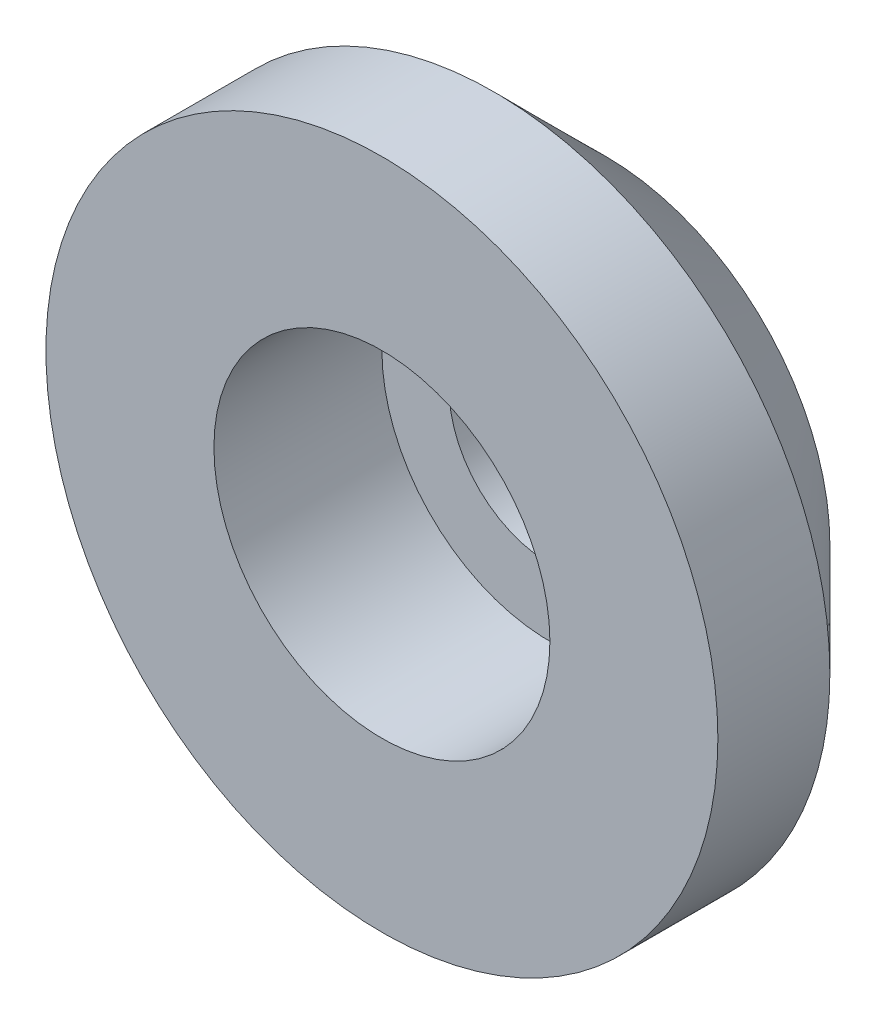
ISO-10303-21;
HEADER;
FILE_DESCRIPTION(('STEP AP214'),'2;1');
FILE_NAME('part.step','',(''),(''),'','','');
FILE_SCHEMA(('AUTOMOTIVE_DESIGN { 1 0 10303 214 1 1 1 1 }'));
ENDSEC;
DATA;
#1=APPLICATION_CONTEXT('core data for automotive mechanical design processes');
#2=APPLICATION_PROTOCOL_DEFINITION('international standard','automotive_design',2000,#1);
#3=PRODUCT_CONTEXT('',#1,'mechanical');
#4=PRODUCT('Part','Part','',(#3));
#5=PRODUCT_RELATED_PRODUCT_CATEGORY('part','',(#4));
#6=PRODUCT_DEFINITION_FORMATION('','',#4);
#7=PRODUCT_DEFINITION_CONTEXT('part definition',#1,'design');
#8=PRODUCT_DEFINITION('design','',#6,#7);
#9=PRODUCT_DEFINITION_SHAPE('','',#8);
#10=(LENGTH_UNIT() NAMED_UNIT(*) SI_UNIT(.MILLI.,.METRE.));
#11=(NAMED_UNIT(*) PLANE_ANGLE_UNIT() SI_UNIT($,.RADIAN.));
#12=(NAMED_UNIT(*) SI_UNIT($,.STERADIAN.) SOLID_ANGLE_UNIT());
#13=UNCERTAINTY_MEASURE_WITH_UNIT(LENGTH_MEASURE(1.E-05),#10,'distance_accuracy_value','');
#14=(GEOMETRIC_REPRESENTATION_CONTEXT(3) GLOBAL_UNCERTAINTY_ASSIGNED_CONTEXT((#13)) GLOBAL_UNIT_ASSIGNED_CONTEXT((#10,
#11,#12)) REPRESENTATION_CONTEXT('',''));
#15=CARTESIAN_POINT('',(0.,0.,0.));
#16=DIRECTION('',(0.,0.,1.));
#17=DIRECTION('',(1.,0.,0.));
#18=AXIS2_PLACEMENT_3D('',#15,#16,#17);
#19=CARTESIAN_POINT('',(0.,0.,2.));
#20=DIRECTION('',(0.,0.,-1.));
#21=DIRECTION('',(-1.,0.,0.));
#22=AXIS2_PLACEMENT_3D('',#19,#20,#21);
#23=CYLINDRICAL_SURFACE('',#22,0.9);
#24=CARTESIAN_POINT('',(0.,0.,0.));
#25=DIRECTION('',(0.,0.,1.));
#26=DIRECTION('',(1.,0.,0.));
#27=AXIS2_PLACEMENT_3D('',#24,#25,#26);
#28=CIRCLE('',#27,0.9);
#29=CARTESIAN_POINT('',(0.9,0.,0.));
#30=VERTEX_POINT('',#29);
#31=EDGE_CURVE('E64',#30,#30,#28,.T.);
#32=ORIENTED_EDGE('',*,*,#31,.F.);
#33=EDGE_LOOP('',(#32));
#34=FACE_BOUND('',#33,.T.);
#35=CARTESIAN_POINT('',(0.,0.,0.5));
#36=DIRECTION('',(0.,0.,1.));
#37=DIRECTION('',(1.,0.,0.));
#38=AXIS2_PLACEMENT_3D('',#35,#36,#37);
#39=CIRCLE('',#38,0.9);
#40=CARTESIAN_POINT('',(0.9,0.,0.5));
#41=VERTEX_POINT('',#40);
#42=EDGE_CURVE('E48',#41,#41,#39,.T.);
#43=ORIENTED_EDGE('',*,*,#42,.T.);
#44=EDGE_LOOP('',(#43));
#45=FACE_BOUND('',#44,.T.);
#46=ADVANCED_FACE('F43',(#34,#45),#23,.F.);
#47=CARTESIAN_POINT('',(0.,0.,2.));
#48=DIRECTION('',(0.,0.,1.));
#49=DIRECTION('',(1.,0.,0.));
#50=AXIS2_PLACEMENT_3D('',#47,#48,#49);
#51=PLANE('',#50);
#52=CARTESIAN_POINT('',(0.,0.,2.));
#53=DIRECTION('',(0.,0.,1.));
#54=DIRECTION('',(1.,0.,0.));
#55=AXIS2_PLACEMENT_3D('',#52,#53,#54);
#56=CIRCLE('',#55,1.5);
#57=CARTESIAN_POINT('',(1.5,0.,2.));
#58=VERTEX_POINT('',#57);
#59=EDGE_CURVE('E68',#58,#58,#56,.T.);
#60=ORIENTED_EDGE('',*,*,#59,.F.);
#61=EDGE_LOOP('',(#60));
#62=FACE_BOUND('',#61,.T.);
#63=CARTESIAN_POINT('',(0.,0.,2.));
#64=DIRECTION('',(0.,0.,1.));
#65=DIRECTION('',(1.,0.,0.));
#66=AXIS2_PLACEMENT_3D('',#63,#64,#65);
#67=CIRCLE('',#66,3.);
#68=CARTESIAN_POINT('',(3.,0.,2.));
#69=VERTEX_POINT('',#68);
#70=EDGE_CURVE('E58',#69,#69,#67,.T.);
#71=ORIENTED_EDGE('',*,*,#70,.T.);
#72=EDGE_LOOP('',(#71));
#73=FACE_BOUND('',#72,.T.);
#74=ADVANCED_FACE('F92',(#62,#73),#51,.T.);
#75=CARTESIAN_POINT('',(0.,0.,0.));
#76=DIRECTION('',(0.,0.,1.));
#77=DIRECTION('',(1.,0.,0.));
#78=AXIS2_PLACEMENT_3D('',#75,#76,#77);
#79=PLANE('',#78);
#80=CARTESIAN_POINT('',(0.,0.,0.));
#81=DIRECTION('',(0.,0.,1.));
#82=DIRECTION('',(1.,0.,0.));
#83=AXIS2_PLACEMENT_3D('',#80,#81,#82);
#84=CIRCLE('',#83,2.);
#85=CARTESIAN_POINT('',(2.,0.,0.));
#86=VERTEX_POINT('',#85);
#87=EDGE_CURVE('E10',#86,#86,#84,.F.);
#88=ORIENTED_EDGE('',*,*,#87,.T.);
#89=EDGE_LOOP('',(#88));
#90=FACE_BOUND('',#89,.T.);
#91=ORIENTED_EDGE('',*,*,#31,.T.);
#92=EDGE_LOOP('',(#91));
#93=FACE_BOUND('',#92,.T.);
#94=ADVANCED_FACE('F98',(#90,#93),#79,.F.);
#95=CARTESIAN_POINT('',(0.,0.,2.));
#96=DIRECTION('',(0.,0.,-1.));
#97=DIRECTION('',(-1.,0.,0.));
#98=AXIS2_PLACEMENT_3D('',#95,#96,#97);
#99=CYLINDRICAL_SURFACE('',#98,3.);
#100=CARTESIAN_POINT('',(0.,0.,0.999999999999999));
#101=DIRECTION('',(0.,0.,1.));
#102=DIRECTION('',(1.,0.,0.));
#103=AXIS2_PLACEMENT_3D('',#100,#101,#102);
#104=CIRCLE('',#103,3.);
#105=CARTESIAN_POINT('',(3.,0.,0.999999999999999));
#106=VERTEX_POINT('',#105);
#107=EDGE_CURVE('E53',#106,#106,#104,.T.);
#108=ORIENTED_EDGE('',*,*,#107,.T.);
#109=EDGE_LOOP('',(#108));
#110=FACE_BOUND('',#109,.T.);
#111=ORIENTED_EDGE('',*,*,#70,.F.);
#112=EDGE_LOOP('',(#111));
#113=FACE_BOUND('',#112,.T.);
#114=ADVANCED_FACE('F104',(#110,#113),#99,.T.);
#115=CARTESIAN_POINT('',(0.,0.,0.999999999999999));
#116=DIRECTION('',(0.,0.,1.));
#117=DIRECTION('',(1.,0.,0.));
#118=AXIS2_PLACEMENT_3D('',#115,#116,#117);
#119=CONICAL_SURFACE('',#118,3.,0.78539816339745);
#120=ORIENTED_EDGE('',*,*,#87,.F.);
#121=EDGE_LOOP('',(#120));
#122=FACE_BOUND('',#121,.T.);
#123=ORIENTED_EDGE('',*,*,#107,.F.);
#124=EDGE_LOOP('',(#123));
#125=FACE_BOUND('',#124,.T.);
#126=ADVANCED_FACE('F46',(#122,#125),#119,.T.);
#127=CARTESIAN_POINT('',(0.,0.,0.5));
#128=DIRECTION('',(0.,0.,1.));
#129=DIRECTION('',(1.,0.,0.));
#130=AXIS2_PLACEMENT_3D('',#127,#128,#129);
#131=CYLINDRICAL_SURFACE('',#130,1.5);
#132=CARTESIAN_POINT('',(0.,0.,0.5));
#133=DIRECTION('',(0.,0.,1.));
#134=DIRECTION('',(1.,0.,0.));
#135=AXIS2_PLACEMENT_3D('',#132,#133,#134);
#136=CIRCLE('',#135,1.5);
#137=CARTESIAN_POINT('',(1.5,0.,0.5));
#138=VERTEX_POINT('',#137);
#139=EDGE_CURVE('E72',#138,#138,#136,.T.);
#140=ORIENTED_EDGE('',*,*,#139,.F.);
#141=EDGE_LOOP('',(#140));
#142=FACE_BOUND('',#141,.T.);
#143=ORIENTED_EDGE('',*,*,#59,.T.);
#144=EDGE_LOOP('',(#143));
#145=FACE_BOUND('',#144,.T.);
#146=ADVANCED_FACE('F84',(#142,#145),#131,.F.);
#147=CARTESIAN_POINT('',(0.,0.,0.5));
#148=DIRECTION('',(0.,0.,1.));
#149=DIRECTION('',(1.,0.,0.));
#150=AXIS2_PLACEMENT_3D('',#147,#148,#149);
#151=PLANE('',#150);
#152=ORIENTED_EDGE('',*,*,#42,.F.);
#153=EDGE_LOOP('',(#152));
#154=FACE_BOUND('',#153,.T.);
#155=ORIENTED_EDGE('',*,*,#139,.T.);
#156=EDGE_LOOP('',(#155));
#157=FACE_BOUND('',#156,.T.);
#158=ADVANCED_FACE('F82',(#154,#157),#151,.T.);
#159=CLOSED_SHELL('',(#46,#74,#94,#114,#126,#146,#158));
#160=MANIFOLD_SOLID_BREP('B2',#159);
#161=ADVANCED_BREP_SHAPE_REPRESENTATION('',(#18,#160),#14);
#162=SHAPE_DEFINITION_REPRESENTATION(#9,#161);
ENDSEC;
END-ISO-10303-21;
